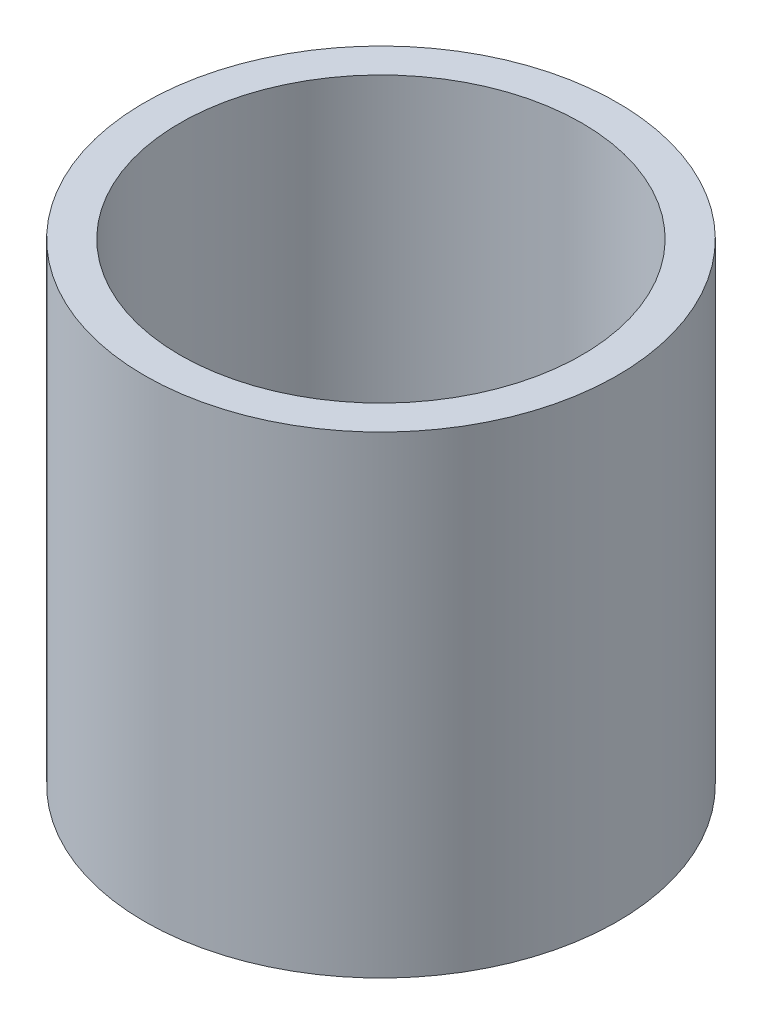
ISO-10303-21;
HEADER;
FILE_DESCRIPTION(('STEP AP214'),'2;1');
FILE_NAME('part.step','',(''),(''),'','','');
FILE_SCHEMA(('AUTOMOTIVE_DESIGN { 1 0 10303 214 1 1 1 1 }'));
ENDSEC;
DATA;
#1=APPLICATION_CONTEXT('core data for automotive mechanical design processes');
#2=APPLICATION_PROTOCOL_DEFINITION('international standard','automotive_design',2000,#1);
#3=PRODUCT_CONTEXT('',#1,'mechanical');
#4=PRODUCT('Part','Part','',(#3));
#5=PRODUCT_RELATED_PRODUCT_CATEGORY('part','',(#4));
#6=PRODUCT_DEFINITION_FORMATION('','',#4);
#7=PRODUCT_DEFINITION_CONTEXT('part definition',#1,'design');
#8=PRODUCT_DEFINITION('design','',#6,#7);
#9=PRODUCT_DEFINITION_SHAPE('','',#8);
#10=(LENGTH_UNIT() NAMED_UNIT(*) SI_UNIT(.MILLI.,.METRE.));
#11=(NAMED_UNIT(*) PLANE_ANGLE_UNIT() SI_UNIT($,.RADIAN.));
#12=(NAMED_UNIT(*) SI_UNIT($,.STERADIAN.) SOLID_ANGLE_UNIT());
#13=UNCERTAINTY_MEASURE_WITH_UNIT(LENGTH_MEASURE(1.E-05),#10,'distance_accuracy_value','');
#14=(GEOMETRIC_REPRESENTATION_CONTEXT(3) GLOBAL_UNCERTAINTY_ASSIGNED_CONTEXT((#13)) GLOBAL_UNIT_ASSIGNED_CONTEXT((#10,
#11,#12)) REPRESENTATION_CONTEXT('',''));
#15=CARTESIAN_POINT('',(0.,0.,0.));
#16=DIRECTION('',(0.,0.,1.));
#17=DIRECTION('',(1.,0.,0.));
#18=AXIS2_PLACEMENT_3D('',#15,#16,#17);
#19=CARTESIAN_POINT('',(0.,40.,0.));
#20=DIRECTION('',(0.,1.,0.));
#21=DIRECTION('',(0.,0.,1.));
#22=AXIS2_PLACEMENT_3D('',#19,#20,#21);
#23=PLANE('',#22);
#24=CARTESIAN_POINT('',(0.,40.,0.));
#25=DIRECTION('',(0.,1.,0.));
#26=DIRECTION('',(0.,0.,1.));
#27=AXIS2_PLACEMENT_3D('',#24,#25,#26);
#28=CIRCLE('',#27,20.);
#29=CARTESIAN_POINT('',(0.,40.,20.));
#30=VERTEX_POINT('',#29);
#31=EDGE_CURVE('E10',#30,#30,#28,.T.);
#32=ORIENTED_EDGE('',*,*,#31,.T.);
#33=EDGE_LOOP('',(#32));
#34=FACE_BOUND('',#33,.T.);
#35=CARTESIAN_POINT('',(0.,40.,0.));
#36=DIRECTION('',(0.,1.,0.));
#37=DIRECTION('',(0.,0.,1.));
#38=AXIS2_PLACEMENT_3D('',#35,#36,#37);
#39=CIRCLE('',#38,17.);
#40=CARTESIAN_POINT('',(0.,40.,17.));
#41=VERTEX_POINT('',#40);
#42=EDGE_CURVE('E42',#41,#41,#39,.T.);
#43=ORIENTED_EDGE('',*,*,#42,.F.);
#44=EDGE_LOOP('',(#43));
#45=FACE_BOUND('',#44,.T.);
#46=ADVANCED_FACE('F31',(#34,#45),#23,.T.);
#47=CARTESIAN_POINT('',(0.,0.,0.));
#48=DIRECTION('',(0.,1.,0.));
#49=DIRECTION('',(0.,0.,1.));
#50=AXIS2_PLACEMENT_3D('',#47,#48,#49);
#51=PLANE('',#50);
#52=CARTESIAN_POINT('',(0.,0.,0.));
#53=DIRECTION('',(0.,1.,0.));
#54=DIRECTION('',(0.,0.,1.));
#55=AXIS2_PLACEMENT_3D('',#52,#53,#54);
#56=CIRCLE('',#55,20.);
#57=CARTESIAN_POINT('',(0.,0.,20.));
#58=VERTEX_POINT('',#57);
#59=EDGE_CURVE('E35',#58,#58,#56,.T.);
#60=ORIENTED_EDGE('',*,*,#59,.F.);
#61=EDGE_LOOP('',(#60));
#62=FACE_BOUND('',#61,.T.);
#63=CARTESIAN_POINT('',(0.,0.,0.));
#64=DIRECTION('',(0.,1.,0.));
#65=DIRECTION('',(0.,0.,1.));
#66=AXIS2_PLACEMENT_3D('',#63,#64,#65);
#67=CIRCLE('',#66,17.);
#68=CARTESIAN_POINT('',(0.,0.,17.));
#69=VERTEX_POINT('',#68);
#70=EDGE_CURVE('E44',#69,#69,#67,.T.);
#71=ORIENTED_EDGE('',*,*,#70,.T.);
#72=EDGE_LOOP('',(#71));
#73=FACE_BOUND('',#72,.T.);
#74=ADVANCED_FACE('F54',(#62,#73),#51,.F.);
#75=CARTESIAN_POINT('',(0.,40.,0.));
#76=DIRECTION('',(0.,-1.,0.));
#77=DIRECTION('',(0.,0.,-1.));
#78=AXIS2_PLACEMENT_3D('',#75,#76,#77);
#79=CYLINDRICAL_SURFACE('',#78,20.);
#80=ORIENTED_EDGE('',*,*,#31,.F.);
#81=EDGE_LOOP('',(#80));
#82=FACE_BOUND('',#81,.T.);
#83=ORIENTED_EDGE('',*,*,#59,.T.);
#84=EDGE_LOOP('',(#83));
#85=FACE_BOUND('',#84,.T.);
#86=ADVANCED_FACE('F33',(#82,#85),#79,.T.);
#87=CARTESIAN_POINT('',(0.,40.,0.));
#88=DIRECTION('',(0.,-1.,0.));
#89=DIRECTION('',(0.,0.,-1.));
#90=AXIS2_PLACEMENT_3D('',#87,#88,#89);
#91=CYLINDRICAL_SURFACE('',#90,17.);
#92=ORIENTED_EDGE('',*,*,#42,.T.);
#93=EDGE_LOOP('',(#92));
#94=FACE_BOUND('',#93,.T.);
#95=ORIENTED_EDGE('',*,*,#70,.F.);
#96=EDGE_LOOP('',(#95));
#97=FACE_BOUND('',#96,.T.);
#98=ADVANCED_FACE('F50',(#94,#97),#91,.F.);
#99=CLOSED_SHELL('',(#46,#74,#86,#98));
#100=MANIFOLD_SOLID_BREP('B2',#99);
#101=ADVANCED_BREP_SHAPE_REPRESENTATION('',(#18,#100),#14);
#102=SHAPE_DEFINITION_REPRESENTATION(#9,#101);
ENDSEC;
END-ISO-10303-21;
